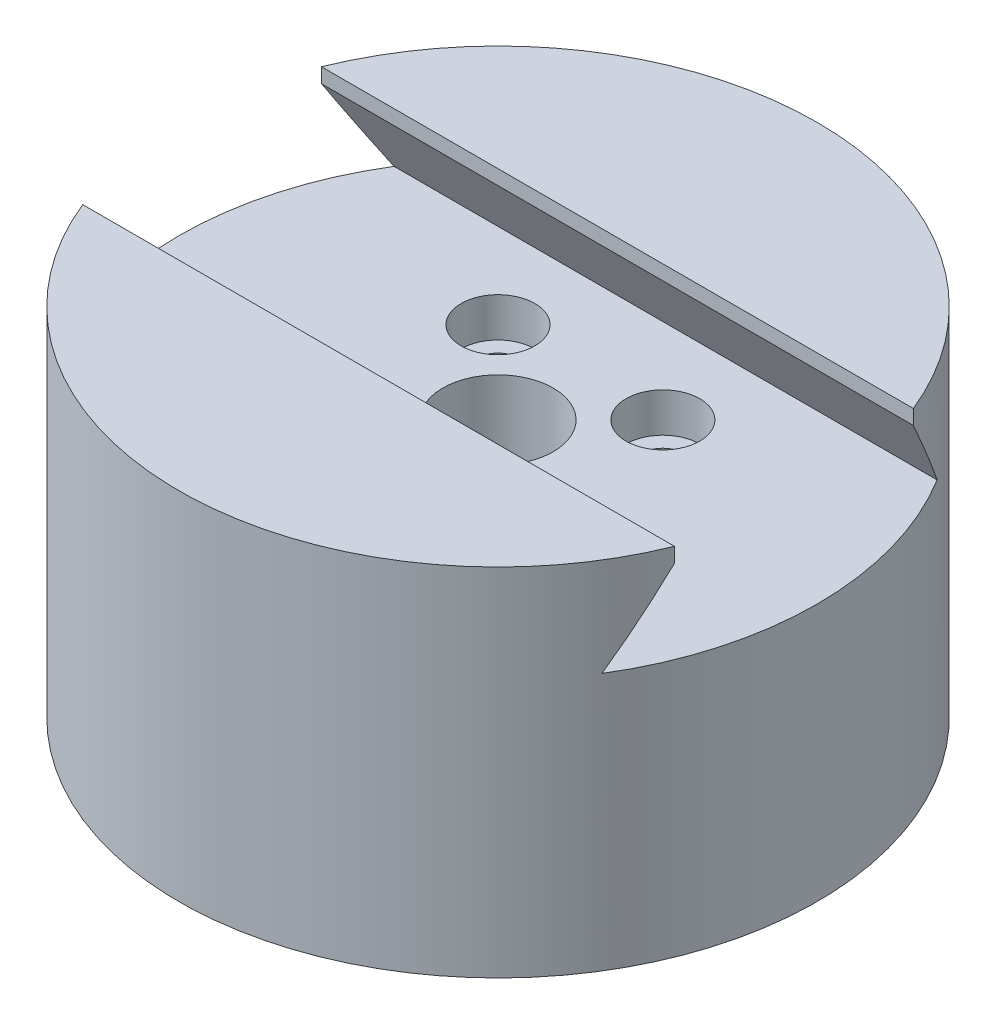
ISO-10303-21;
HEADER;
FILE_DESCRIPTION(('STEP AP214'),'2;1');
FILE_NAME('part.step','',(''),(''),'','','');
FILE_SCHEMA(('AUTOMOTIVE_DESIGN { 1 0 10303 214 1 1 1 1 }'));
ENDSEC;
DATA;
#1=APPLICATION_CONTEXT('core data for automotive mechanical design processes');
#2=APPLICATION_PROTOCOL_DEFINITION('international standard','automotive_design',2000,#1);
#3=PRODUCT_CONTEXT('',#1,'mechanical');
#4=PRODUCT('Part','Part','',(#3));
#5=PRODUCT_RELATED_PRODUCT_CATEGORY('part','',(#4));
#6=PRODUCT_DEFINITION_FORMATION('','',#4);
#7=PRODUCT_DEFINITION_CONTEXT('part definition',#1,'design');
#8=PRODUCT_DEFINITION('design','',#6,#7);
#9=PRODUCT_DEFINITION_SHAPE('','',#8);
#10=(LENGTH_UNIT() NAMED_UNIT(*) SI_UNIT(.MILLI.,.METRE.));
#11=(NAMED_UNIT(*) PLANE_ANGLE_UNIT() SI_UNIT($,.RADIAN.));
#12=(NAMED_UNIT(*) SI_UNIT($,.STERADIAN.) SOLID_ANGLE_UNIT());
#13=UNCERTAINTY_MEASURE_WITH_UNIT(LENGTH_MEASURE(1.E-05),#10,'distance_accuracy_value','');
#14=(GEOMETRIC_REPRESENTATION_CONTEXT(3) GLOBAL_UNCERTAINTY_ASSIGNED_CONTEXT((#13)) GLOBAL_UNIT_ASSIGNED_CONTEXT((#10,
#11,#12)) REPRESENTATION_CONTEXT('',''));
#15=CARTESIAN_POINT('',(0.,0.,0.));
#16=DIRECTION('',(0.,0.,1.));
#17=DIRECTION('',(1.,0.,0.));
#18=AXIS2_PLACEMENT_3D('',#15,#16,#17);
#19=CARTESIAN_POINT('',(0.,14.,0.));
#20=DIRECTION('',(0.,1.,0.));
#21=DIRECTION('',(0.,0.,1.));
#22=AXIS2_PLACEMENT_3D('',#19,#20,#21);
#23=PLANE('',#22);
#24=DIRECTION('',(1.,0.,0.));
#25=VECTOR('',#24,1.);
#26=CARTESIAN_POINT('',(0.,14.,9.72871870788977));
#27=LINE('',#26,#25);
#28=CARTESIAN_POINT('',(-24.1112428610131,14.,9.72871870788977));
#29=VERTEX_POINT('',#28);
#30=CARTESIAN_POINT('',(24.1112428610131,14.,9.72871870788977));
#31=VERTEX_POINT('',#30);
#32=EDGE_CURVE('E155',#29,#31,#27,.T.);
#33=ORIENTED_EDGE('',*,*,#32,.F.);
#34=CARTESIAN_POINT('',(0.,14.,0.));
#35=DIRECTION('',(0.,1.,0.));
#36=DIRECTION('',(0.,0.,1.));
#37=AXIS2_PLACEMENT_3D('',#34,#35,#36);
#38=CIRCLE('',#37,26.);
#39=EDGE_CURVE('E149',#29,#31,#38,.T.);
#40=ORIENTED_EDGE('',*,*,#39,.T.);
#41=EDGE_LOOP('',(#33,#40));
#42=FACE_BOUND('',#41,.T.);
#43=ADVANCED_FACE('F37',(#42),#23,.T.);
#44=CARTESIAN_POINT('',(0.,14.,0.));
#45=DIRECTION('',(0.,-1.,0.));
#46=DIRECTION('',(0.,0.,-1.));
#47=AXIS2_PLACEMENT_3D('',#44,#45,#46);
#48=CYLINDRICAL_SURFACE('',#47,26.);
#49=CARTESIAN_POINT('',(0.,29.6506350946107,0.));
#50=DIRECTION('',(0.,0.500000000000004,0.866025403784436));
#51=DIRECTION('',(0.,-0.866025403784436,0.500000000000004));
#52=AXIS2_PLACEMENT_3D('',#49,#50,#51);
#53=ELLIPSE('',#52,51.9999999999996,26.);
#54=CARTESIAN_POINT('',(22.1257576866236,6.,13.6547005383793));
#55=VERTEX_POINT('',#54);
#56=CARTESIAN_POINT('',(24.1112428610131,12.8,9.72871870788977));
#57=VERTEX_POINT('',#56);
#58=EDGE_CURVE('E12',#55,#57,#53,.T.);
#59=ORIENTED_EDGE('',*,*,#58,.T.);
#60=DIRECTION('',(0.,-1.,0.));
#61=VECTOR('',#60,1.);
#62=CARTESIAN_POINT('',(24.1112428610131,14.,9.72871870788977));
#63=LINE('',#62,#61);
#64=EDGE_CURVE('E143',#57,#31,#63,.F.);
#65=ORIENTED_EDGE('',*,*,#64,.T.);
#66=ORIENTED_EDGE('',*,*,#39,.F.);
#67=DIRECTION('',(0.,-1.,0.));
#68=VECTOR('',#67,1.);
#69=CARTESIAN_POINT('',(-24.1112428610131,14.,9.72871870788977));
#70=LINE('',#69,#68);
#71=CARTESIAN_POINT('',(-24.1112428610131,12.8,9.72871870788977));
#72=VERTEX_POINT('',#71);
#73=EDGE_CURVE('E146',#29,#72,#70,.T.);
#74=ORIENTED_EDGE('',*,*,#73,.T.);
#75=CARTESIAN_POINT('',(-22.1257576866236,6.,13.6547005383793));
#76=VERTEX_POINT('',#75);
#77=EDGE_CURVE('E47',#72,#76,#53,.T.);
#78=ORIENTED_EDGE('',*,*,#77,.T.);
#79=CARTESIAN_POINT('',(0.,6.,0.));
#80=DIRECTION('',(0.,-1.,0.));
#81=DIRECTION('',(0.,0.,-1.));
#82=AXIS2_PLACEMENT_3D('',#79,#80,#81);
#83=CIRCLE('',#82,26.);
#84=CARTESIAN_POINT('',(-22.1257576866236,6.00000000000001,-13.6547005383793));
#85=VERTEX_POINT('',#84);
#86=EDGE_CURVE('E157',#76,#85,#83,.T.);
#87=ORIENTED_EDGE('',*,*,#86,.T.);
#88=CARTESIAN_POINT('',(0.,29.6506350946107,0.));
#89=DIRECTION('',(0.,0.500000000000004,-0.866025403784436));
#90=DIRECTION('',(0.,-0.866025403784436,-0.500000000000004));
#91=AXIS2_PLACEMENT_3D('',#88,#89,#90);
#92=ELLIPSE('',#91,51.9999999999995,26.);
#93=CARTESIAN_POINT('',(-24.1112428610131,12.8,-9.72871870788977));
#94=VERTEX_POINT('',#93);
#95=EDGE_CURVE('E160',#85,#94,#92,.T.);
#96=ORIENTED_EDGE('',*,*,#95,.T.);
#97=DIRECTION('',(0.,-1.,0.));
#98=VECTOR('',#97,1.);
#99=CARTESIAN_POINT('',(-24.1112428610131,14.,-9.72871870788977));
#100=LINE('',#99,#98);
#101=CARTESIAN_POINT('',(-24.1112428610131,14.,-9.72871870788977));
#102=VERTEX_POINT('',#101);
#103=EDGE_CURVE('E131',#94,#102,#100,.F.);
#104=ORIENTED_EDGE('',*,*,#103,.T.);
#105=CARTESIAN_POINT('',(24.1112428610131,14.,-9.72871870788977));
#106=VERTEX_POINT('',#105);
#107=EDGE_CURVE('E152',#106,#102,#38,.T.);
#108=ORIENTED_EDGE('',*,*,#107,.F.);
#109=DIRECTION('',(0.,-1.,0.));
#110=VECTOR('',#109,1.);
#111=CARTESIAN_POINT('',(24.1112428610131,14.,-9.72871870788977));
#112=LINE('',#111,#110);
#113=CARTESIAN_POINT('',(24.1112428610131,12.8,-9.72871870788977));
#114=VERTEX_POINT('',#113);
#115=EDGE_CURVE('E62',#106,#114,#112,.T.);
#116=ORIENTED_EDGE('',*,*,#115,.T.);
#117=CARTESIAN_POINT('',(22.1257576866236,6.00000000000001,-13.6547005383793));
#118=VERTEX_POINT('',#117);
#119=EDGE_CURVE('E46',#114,#118,#92,.T.);
#120=ORIENTED_EDGE('',*,*,#119,.T.);
#121=EDGE_CURVE('E161',#118,#55,#83,.T.);
#122=ORIENTED_EDGE('',*,*,#121,.T.);
#123=EDGE_LOOP('',(#59,#65,#66,#74,#78,#87,#96,#104,#108,#116,#120,#122));
#124=FACE_BOUND('',#123,.T.);
#125=CARTESIAN_POINT('',(0.,-15.,0.));
#126=DIRECTION('',(0.,-1.,0.));
#127=DIRECTION('',(0.,0.,-1.));
#128=AXIS2_PLACEMENT_3D('',#125,#126,#127);
#129=CIRCLE('',#128,26.);
#130=CARTESIAN_POINT('',(0.,-15.,-26.));
#131=VERTEX_POINT('',#130);
#132=EDGE_CURVE('E433',#131,#131,#129,.T.);
#133=ORIENTED_EDGE('',*,*,#132,.F.);
#134=EDGE_LOOP('',(#133));
#135=FACE_BOUND('',#134,.T.);
#136=ADVANCED_FACE('F39',(#124,#135),#48,.T.);
#137=DIRECTION('',(-1.,0.,0.));
#138=VECTOR('',#137,1.);
#139=CARTESIAN_POINT('',(0.,14.,-9.72871870788977));
#140=LINE('',#139,#138);
#141=EDGE_CURVE('E153',#106,#102,#140,.T.);
#142=ORIENTED_EDGE('',*,*,#141,.F.);
#143=ORIENTED_EDGE('',*,*,#107,.T.);
#144=EDGE_LOOP('',(#142,#143));
#145=FACE_BOUND('',#144,.T.);
#146=ADVANCED_FACE('F176',(#145),#23,.T.);
#147=CARTESIAN_POINT('',(0.,0.,0.));
#148=DIRECTION('',(0.,1.,0.));
#149=DIRECTION('',(0.,0.,1.));
#150=AXIS2_PLACEMENT_3D('',#147,#148,#149);
#151=PLANE('',#150);
#152=CARTESIAN_POINT('',(0.,0.,0.));
#153=DIRECTION('',(0.,-1.,0.));
#154=DIRECTION('',(0.,0.,-1.));
#155=AXIS2_PLACEMENT_3D('',#152,#153,#154);
#156=CIRCLE('',#155,24.);
#157=CARTESIAN_POINT('',(0.,0.,-24.));
#158=VERTEX_POINT('',#157);
#159=EDGE_CURVE('E431',#158,#158,#156,.T.);
#160=ORIENTED_EDGE('',*,*,#159,.T.);
#161=EDGE_LOOP('',(#160));
#162=FACE_BOUND('',#161,.T.);
#163=CARTESIAN_POINT('',(-6.7175144212722,0.,-6.7175144212722));
#164=DIRECTION('',(0.,1.,0.));
#165=DIRECTION('',(0.,0.,1.));
#166=AXIS2_PLACEMENT_3D('',#163,#164,#165);
#167=CIRCLE('',#166,1.7);
#168=CARTESIAN_POINT('',(-6.7175144212722,0.,-5.0175144212722));
#169=VERTEX_POINT('',#168);
#170=EDGE_CURVE('E447',#169,#169,#167,.T.);
#171=ORIENTED_EDGE('',*,*,#170,.T.);
#172=EDGE_LOOP('',(#171));
#173=FACE_BOUND('',#172,.T.);
#174=CARTESIAN_POINT('',(6.7175144212722,0.,-6.7175144212722));
#175=DIRECTION('',(0.,1.,0.));
#176=DIRECTION('',(0.,0.,1.));
#177=AXIS2_PLACEMENT_3D('',#174,#175,#176);
#178=CIRCLE('',#177,1.7);
#179=CARTESIAN_POINT('',(6.7175144212722,0.,-5.0175144212722));
#180=VERTEX_POINT('',#179);
#181=EDGE_CURVE('E459',#180,#180,#178,.T.);
#182=ORIENTED_EDGE('',*,*,#181,.T.);
#183=EDGE_LOOP('',(#182));
#184=FACE_BOUND('',#183,.T.);
#185=CARTESIAN_POINT('',(6.71751442127219,0.,6.71751442127221));
#186=DIRECTION('',(0.,1.,0.));
#187=DIRECTION('',(0.,0.,1.));
#188=AXIS2_PLACEMENT_3D('',#185,#186,#187);
#189=CIRCLE('',#188,1.7);
#190=CARTESIAN_POINT('',(6.71751442127219,0.,8.41751442127221));
#191=VERTEX_POINT('',#190);
#192=EDGE_CURVE('E471',#191,#191,#189,.T.);
#193=ORIENTED_EDGE('',*,*,#192,.T.);
#194=EDGE_LOOP('',(#193));
#195=FACE_BOUND('',#194,.T.);
#196=CARTESIAN_POINT('',(-6.7175144212722,0.,6.7175144212722));
#197=DIRECTION('',(0.,1.,0.));
#198=DIRECTION('',(0.,0.,1.));
#199=AXIS2_PLACEMENT_3D('',#196,#197,#198);
#200=CIRCLE('',#199,1.7);
#201=CARTESIAN_POINT('',(-6.7175144212722,0.,8.4175144212722));
#202=VERTEX_POINT('',#201);
#203=EDGE_CURVE('E483',#202,#202,#200,.T.);
#204=ORIENTED_EDGE('',*,*,#203,.T.);
#205=EDGE_LOOP('',(#204));
#206=FACE_BOUND('',#205,.T.);
#207=CARTESIAN_POINT('',(0.,0.,0.));
#208=DIRECTION('',(0.,-1.,0.));
#209=DIRECTION('',(0.,0.,-1.));
#210=AXIS2_PLACEMENT_3D('',#207,#208,#209);
#211=CIRCLE('',#210,23.9);
#212=CARTESIAN_POINT('',(-18.0593563299933,0.,-15.6547005383793));
#213=VERTEX_POINT('',#212);
#214=CARTESIAN_POINT('',(18.0593563299933,0.,-15.6547005383793));
#215=VERTEX_POINT('',#214);
#216=EDGE_CURVE('E120',#213,#215,#211,.T.);
#217=ORIENTED_EDGE('',*,*,#216,.F.);
#218=DIRECTION('',(-1.,0.,0.));
#219=VECTOR('',#218,1.);
#220=CARTESIAN_POINT('',(-18.0593563299933,0.,-15.6547005383793));
#221=LINE('',#220,#219);
#222=EDGE_CURVE('E54',#215,#213,#221,.T.);
#223=ORIENTED_EDGE('',*,*,#222,.F.);
#224=EDGE_LOOP('',(#217,#223));
#225=FACE_BOUND('',#224,.T.);
#226=CARTESIAN_POINT('',(0.,0.,0.));
#227=DIRECTION('',(0.,-1.,0.));
#228=DIRECTION('',(0.,0.,-1.));
#229=AXIS2_PLACEMENT_3D('',#226,#227,#228);
#230=CIRCLE('',#229,4.5);
#231=CARTESIAN_POINT('',(0.,0.,-4.5));
#232=VERTEX_POINT('',#231);
#233=EDGE_CURVE('E125',#232,#232,#230,.T.);
#234=ORIENTED_EDGE('',*,*,#233,.F.);
#235=EDGE_LOOP('',(#234));
#236=FACE_BOUND('',#235,.T.);
#237=ADVANCED_FACE('F178',(#162,#173,#184,#195,#206,#225,#236),#151,.F.);
#238=CARTESIAN_POINT('',(-30.,6.,13.6547005383793));
#239=DIRECTION('',(0.,0.500000000000004,0.866025403784436));
#240=DIRECTION('',(0.,-0.866025403784436,0.500000000000004));
#241=AXIS2_PLACEMENT_3D('',#238,#239,#240);
#242=PLANE('',#241);
#243=DIRECTION('',(1.,0.,0.));
#244=VECTOR('',#243,1.);
#245=CARTESIAN_POINT('',(-30.,6.,13.6547005383793));
#246=LINE('',#245,#244);
#247=EDGE_CURVE('E137',#76,#55,#246,.T.);
#248=ORIENTED_EDGE('',*,*,#247,.F.);
#249=ORIENTED_EDGE('',*,*,#77,.F.);
#250=DIRECTION('',(1.,0.,0.));
#251=VECTOR('',#250,1.);
#252=CARTESIAN_POINT('',(-30.,12.8,9.72871870788977));
#253=LINE('',#252,#251);
#254=EDGE_CURVE('E128',#72,#57,#253,.T.);
#255=ORIENTED_EDGE('',*,*,#254,.T.);
#256=ORIENTED_EDGE('',*,*,#58,.F.);
#257=EDGE_LOOP('',(#248,#249,#255,#256));
#258=FACE_BOUND('',#257,.T.);
#259=ADVANCED_FACE('F185',(#258),#242,.F.);
#260=CARTESIAN_POINT('',(-30.,6.00000000000001,-13.6547005383793));
#261=DIRECTION('',(0.,0.500000000000004,-0.866025403784436));
#262=DIRECTION('',(0.,0.866025403784436,0.500000000000004));
#263=AXIS2_PLACEMENT_3D('',#260,#261,#262);
#264=PLANE('',#263);
#265=DIRECTION('',(1.,0.,0.));
#266=VECTOR('',#265,1.);
#267=CARTESIAN_POINT('',(-30.,6.00000000000001,-13.6547005383793));
#268=LINE('',#267,#266);
#269=EDGE_CURVE('E134',#85,#118,#268,.T.);
#270=ORIENTED_EDGE('',*,*,#269,.T.);
#271=ORIENTED_EDGE('',*,*,#119,.F.);
#272=DIRECTION('',(1.,0.,0.));
#273=VECTOR('',#272,1.);
#274=CARTESIAN_POINT('',(-30.,12.8,-9.72871870788977));
#275=LINE('',#274,#273);
#276=EDGE_CURVE('E132',#94,#114,#275,.T.);
#277=ORIENTED_EDGE('',*,*,#276,.F.);
#278=ORIENTED_EDGE('',*,*,#95,.F.);
#279=EDGE_LOOP('',(#270,#271,#277,#278));
#280=FACE_BOUND('',#279,.T.);
#281=ADVANCED_FACE('F171',(#280),#264,.F.);
#282=CARTESIAN_POINT('',(-30.,6.00000000000001,-13.6547005383793));
#283=DIRECTION('',(0.,-1.,0.));
#284=DIRECTION('',(0.,0.,-1.));
#285=AXIS2_PLACEMENT_3D('',#282,#283,#284);
#286=PLANE('',#285);
#287=CARTESIAN_POINT('',(-6.7175144212722,6.,-6.7175144212722));
#288=DIRECTION('',(0.,1.,0.));
#289=DIRECTION('',(0.,0.,1.));
#290=AXIS2_PLACEMENT_3D('',#287,#288,#289);
#291=CIRCLE('',#290,3.);
#292=CARTESIAN_POINT('',(-6.7175144212722,6.,-3.7175144212722));
#293=VERTEX_POINT('',#292);
#294=EDGE_CURVE('E438',#293,#293,#291,.T.);
#295=ORIENTED_EDGE('',*,*,#294,.F.);
#296=EDGE_LOOP('',(#295));
#297=FACE_BOUND('',#296,.T.);
#298=CARTESIAN_POINT('',(6.7175144212722,6.,-6.7175144212722));
#299=DIRECTION('',(0.,1.,0.));
#300=DIRECTION('',(0.,0.,1.));
#301=AXIS2_PLACEMENT_3D('',#298,#299,#300);
#302=CIRCLE('',#301,3.);
#303=CARTESIAN_POINT('',(6.7175144212722,6.,-3.7175144212722));
#304=VERTEX_POINT('',#303);
#305=EDGE_CURVE('E450',#304,#304,#302,.T.);
#306=ORIENTED_EDGE('',*,*,#305,.F.);
#307=EDGE_LOOP('',(#306));
#308=FACE_BOUND('',#307,.T.);
#309=CARTESIAN_POINT('',(6.71751442127219,6.,6.71751442127221));
#310=DIRECTION('',(0.,1.,0.));
#311=DIRECTION('',(0.,0.,1.));
#312=AXIS2_PLACEMENT_3D('',#309,#310,#311);
#313=CIRCLE('',#312,3.);
#314=CARTESIAN_POINT('',(6.71751442127219,6.,9.71751442127221));
#315=VERTEX_POINT('',#314);
#316=EDGE_CURVE('E462',#315,#315,#313,.T.);
#317=ORIENTED_EDGE('',*,*,#316,.F.);
#318=EDGE_LOOP('',(#317));
#319=FACE_BOUND('',#318,.T.);
#320=CARTESIAN_POINT('',(-6.7175144212722,6.,6.7175144212722));
#321=DIRECTION('',(0.,1.,0.));
#322=DIRECTION('',(0.,0.,1.));
#323=AXIS2_PLACEMENT_3D('',#320,#321,#322);
#324=CIRCLE('',#323,3.);
#325=CARTESIAN_POINT('',(-6.7175144212722,6.,9.7175144212722));
#326=VERTEX_POINT('',#325);
#327=EDGE_CURVE('E474',#326,#326,#324,.T.);
#328=ORIENTED_EDGE('',*,*,#327,.F.);
#329=EDGE_LOOP('',(#328));
#330=FACE_BOUND('',#329,.T.);
#331=CARTESIAN_POINT('',(0.,6.,0.));
#332=DIRECTION('',(0.,-1.,0.));
#333=DIRECTION('',(0.,0.,-1.));
#334=AXIS2_PLACEMENT_3D('',#331,#332,#333);
#335=CIRCLE('',#334,4.5);
#336=CARTESIAN_POINT('',(0.,6.,-4.5));
#337=VERTEX_POINT('',#336);
#338=EDGE_CURVE('E41',#337,#337,#335,.T.);
#339=ORIENTED_EDGE('',*,*,#338,.T.);
#340=EDGE_LOOP('',(#339));
#341=FACE_BOUND('',#340,.T.);
#342=ORIENTED_EDGE('',*,*,#269,.F.);
#343=ORIENTED_EDGE('',*,*,#86,.F.);
#344=ORIENTED_EDGE('',*,*,#247,.T.);
#345=ORIENTED_EDGE('',*,*,#121,.F.);
#346=EDGE_LOOP('',(#342,#343,#344,#345));
#347=FACE_BOUND('',#346,.T.);
#348=ADVANCED_FACE('F200',(#297,#308,#319,#330,#341,#347),#286,.F.);
#349=CARTESIAN_POINT('',(-30.,12.8,9.72871870788977));
#350=DIRECTION('',(0.,0.,1.));
#351=DIRECTION('',(1.,0.,0.));
#352=AXIS2_PLACEMENT_3D('',#349,#350,#351);
#353=PLANE('',#352);
#354=ORIENTED_EDGE('',*,*,#32,.T.);
#355=ORIENTED_EDGE('',*,*,#64,.F.);
#356=ORIENTED_EDGE('',*,*,#254,.F.);
#357=ORIENTED_EDGE('',*,*,#73,.F.);
#358=EDGE_LOOP('',(#354,#355,#356,#357));
#359=FACE_BOUND('',#358,.T.);
#360=ADVANCED_FACE('F196',(#359),#353,.F.);
#361=CARTESIAN_POINT('',(-30.,12.8,-9.72871870788977));
#362=DIRECTION('',(0.,0.,-1.));
#363=DIRECTION('',(-1.,0.,0.));
#364=AXIS2_PLACEMENT_3D('',#361,#362,#363);
#365=PLANE('',#364);
#366=ORIENTED_EDGE('',*,*,#141,.T.);
#367=ORIENTED_EDGE('',*,*,#103,.F.);
#368=ORIENTED_EDGE('',*,*,#276,.T.);
#369=ORIENTED_EDGE('',*,*,#115,.F.);
#370=EDGE_LOOP('',(#366,#367,#368,#369));
#371=FACE_BOUND('',#370,.T.);
#372=ADVANCED_FACE('F173',(#371),#365,.F.);
#373=CARTESIAN_POINT('',(0.,14.,0.));
#374=DIRECTION('',(0.,-1.,0.));
#375=DIRECTION('',(0.,0.,-1.));
#376=AXIS2_PLACEMENT_3D('',#373,#374,#375);
#377=CYLINDRICAL_SURFACE('',#376,4.5);
#378=ORIENTED_EDGE('',*,*,#233,.T.);
#379=EDGE_LOOP('',(#378));
#380=FACE_BOUND('',#379,.T.);
#381=ORIENTED_EDGE('',*,*,#338,.F.);
#382=EDGE_LOOP('',(#381));
#383=FACE_BOUND('',#382,.T.);
#384=ADVANCED_FACE('F238',(#380,#383),#377,.F.);
#385=CARTESIAN_POINT('',(0.,12.,0.));
#386=DIRECTION('',(0.,1.,0.));
#387=DIRECTION('',(0.,0.,1.));
#388=AXIS2_PLACEMENT_3D('',#385,#386,#387);
#389=PLANE('',#388);
#390=CARTESIAN_POINT('',(0.,12.,0.));
#391=DIRECTION('',(0.,1.,0.));
#392=DIRECTION('',(0.,0.,1.));
#393=AXIS2_PLACEMENT_3D('',#390,#391,#392);
#394=CIRCLE('',#393,23.9);
#395=CARTESIAN_POINT('',(-18.0593563299933,12.,-15.6547005383793));
#396=VERTEX_POINT('',#395);
#397=CARTESIAN_POINT('',(18.0593563299933,12.,-15.6547005383793));
#398=VERTEX_POINT('',#397);
#399=EDGE_CURVE('E106',#396,#398,#394,.F.);
#400=ORIENTED_EDGE('',*,*,#399,.T.);
#401=DIRECTION('',(-1.,0.,0.));
#402=VECTOR('',#401,1.);
#403=CARTESIAN_POINT('',(-18.0593563299933,12.,-15.6547005383793));
#404=LINE('',#403,#402);
#405=EDGE_CURVE('E116',#398,#396,#404,.T.);
#406=ORIENTED_EDGE('',*,*,#405,.T.);
#407=EDGE_LOOP('',(#400,#406));
#408=FACE_BOUND('',#407,.T.);
#409=ADVANCED_FACE('F118',(#408),#389,.F.);
#410=CARTESIAN_POINT('',(-18.0593563299933,51.0478928878077,-15.6547005383793));
#411=DIRECTION('',(0.,0.,1.));
#412=DIRECTION('',(1.,0.,0.));
#413=AXIS2_PLACEMENT_3D('',#410,#411,#412);
#414=PLANE('',#413);
#415=DIRECTION('',(0.,-1.,0.));
#416=VECTOR('',#415,1.);
#417=CARTESIAN_POINT('',(18.0593563299933,51.0478928878077,-15.6547005383793));
#418=LINE('',#417,#416);
#419=EDGE_CURVE('E111',#398,#215,#418,.T.);
#420=ORIENTED_EDGE('',*,*,#419,.T.);
#421=ORIENTED_EDGE('',*,*,#222,.T.);
#422=DIRECTION('',(0.,-1.,0.));
#423=VECTOR('',#422,1.);
#424=CARTESIAN_POINT('',(-18.0593563299933,51.0478928878077,-15.6547005383793));
#425=LINE('',#424,#423);
#426=EDGE_CURVE('E109',#396,#213,#425,.T.);
#427=ORIENTED_EDGE('',*,*,#426,.F.);
#428=ORIENTED_EDGE('',*,*,#405,.F.);
#429=EDGE_LOOP('',(#420,#421,#427,#428));
#430=FACE_BOUND('',#429,.T.);
#431=ADVANCED_FACE('F115',(#430),#414,.F.);
#432=CARTESIAN_POINT('',(0.,51.0478928878077,0.));
#433=DIRECTION('',(0.,-1.,0.));
#434=DIRECTION('',(0.,0.,-1.));
#435=AXIS2_PLACEMENT_3D('',#432,#433,#434);
#436=CYLINDRICAL_SURFACE('',#435,23.9);
#437=ORIENTED_EDGE('',*,*,#426,.T.);
#438=ORIENTED_EDGE('',*,*,#216,.T.);
#439=ORIENTED_EDGE('',*,*,#419,.F.);
#440=ORIENTED_EDGE('',*,*,#399,.F.);
#441=EDGE_LOOP('',(#437,#438,#439,#440));
#442=FACE_BOUND('',#441,.T.);
#443=ADVANCED_FACE('F107',(#442),#436,.F.);
#444=CARTESIAN_POINT('',(-6.7175144212722,6.,6.7175144212722));
#445=DIRECTION('',(0.,1.,0.));
#446=DIRECTION('',(0.,0.,1.));
#447=AXIS2_PLACEMENT_3D('',#444,#445,#446);
#448=CYLINDRICAL_SURFACE('',#447,1.7);
#449=ORIENTED_EDGE('',*,*,#203,.F.);
#450=EDGE_LOOP('',(#449));
#451=FACE_BOUND('',#450,.T.);
#452=CARTESIAN_POINT('',(-6.7175144212722,2.8,6.7175144212722));
#453=DIRECTION('',(0.,1.,0.));
#454=DIRECTION('',(0.,0.,1.));
#455=AXIS2_PLACEMENT_3D('',#452,#453,#454);
#456=CIRCLE('',#455,1.7);
#457=CARTESIAN_POINT('',(-6.7175144212722,2.8,8.4175144212722));
#458=VERTEX_POINT('',#457);
#459=EDGE_CURVE('E480',#458,#458,#456,.T.);
#460=ORIENTED_EDGE('',*,*,#459,.T.);
#461=EDGE_LOOP('',(#460));
#462=FACE_BOUND('',#461,.T.);
#463=ADVANCED_FACE('F270',(#451,#462),#448,.F.);
#464=CARTESIAN_POINT('',(-5.0175144212722,2.8,6.7175144212722));
#465=DIRECTION('',(0.,-1.,0.));
#466=DIRECTION('',(0.,0.,-1.));
#467=AXIS2_PLACEMENT_3D('',#464,#465,#466);
#468=PLANE('',#467);
#469=ORIENTED_EDGE('',*,*,#459,.F.);
#470=EDGE_LOOP('',(#469));
#471=FACE_BOUND('',#470,.T.);
#472=CARTESIAN_POINT('',(-6.7175144212722,2.8,6.7175144212722));
#473=DIRECTION('',(0.,1.,0.));
#474=DIRECTION('',(0.,0.,1.));
#475=AXIS2_PLACEMENT_3D('',#472,#473,#474);
#476=CIRCLE('',#475,3.);
#477=CARTESIAN_POINT('',(-6.7175144212722,2.8,9.7175144212722));
#478=VERTEX_POINT('',#477);
#479=EDGE_CURVE('E477',#478,#478,#476,.T.);
#480=ORIENTED_EDGE('',*,*,#479,.T.);
#481=EDGE_LOOP('',(#480));
#482=FACE_BOUND('',#481,.T.);
#483=ADVANCED_FACE('F283',(#471,#482),#468,.F.);
#484=CARTESIAN_POINT('',(-6.7175144212722,6.,6.7175144212722));
#485=DIRECTION('',(0.,1.,0.));
#486=DIRECTION('',(0.,0.,1.));
#487=AXIS2_PLACEMENT_3D('',#484,#485,#486);
#488=CYLINDRICAL_SURFACE('',#487,3.);
#489=ORIENTED_EDGE('',*,*,#479,.F.);
#490=EDGE_LOOP('',(#489));
#491=FACE_BOUND('',#490,.T.);
#492=ORIENTED_EDGE('',*,*,#327,.T.);
#493=EDGE_LOOP('',(#492));
#494=FACE_BOUND('',#493,.T.);
#495=ADVANCED_FACE('F293',(#491,#494),#488,.F.);
#496=CARTESIAN_POINT('',(6.71751442127219,6.,6.71751442127221));
#497=DIRECTION('',(0.,1.,0.));
#498=DIRECTION('',(0.,0.,1.));
#499=AXIS2_PLACEMENT_3D('',#496,#497,#498);
#500=CYLINDRICAL_SURFACE('',#499,1.7);
#501=ORIENTED_EDGE('',*,*,#192,.F.);
#502=EDGE_LOOP('',(#501));
#503=FACE_BOUND('',#502,.T.);
#504=CARTESIAN_POINT('',(6.71751442127219,2.8,6.71751442127221));
#505=DIRECTION('',(0.,1.,0.));
#506=DIRECTION('',(0.,0.,1.));
#507=AXIS2_PLACEMENT_3D('',#504,#505,#506);
#508=CIRCLE('',#507,1.7);
#509=CARTESIAN_POINT('',(6.71751442127219,2.8,8.41751442127221));
#510=VERTEX_POINT('',#509);
#511=EDGE_CURVE('E468',#510,#510,#508,.T.);
#512=ORIENTED_EDGE('',*,*,#511,.T.);
#513=EDGE_LOOP('',(#512));
#514=FACE_BOUND('',#513,.T.);
#515=ADVANCED_FACE('F303',(#503,#514),#500,.F.);
#516=CARTESIAN_POINT('',(8.41751442127219,2.8,6.71751442127221));
#517=DIRECTION('',(0.,-1.,0.));
#518=DIRECTION('',(0.,0.,-1.));
#519=AXIS2_PLACEMENT_3D('',#516,#517,#518);
#520=PLANE('',#519);
#521=ORIENTED_EDGE('',*,*,#511,.F.);
#522=EDGE_LOOP('',(#521));
#523=FACE_BOUND('',#522,.T.);
#524=CARTESIAN_POINT('',(6.71751442127219,2.8,6.71751442127221));
#525=DIRECTION('',(0.,1.,0.));
#526=DIRECTION('',(0.,0.,1.));
#527=AXIS2_PLACEMENT_3D('',#524,#525,#526);
#528=CIRCLE('',#527,3.);
#529=CARTESIAN_POINT('',(6.71751442127219,2.8,9.71751442127221));
#530=VERTEX_POINT('',#529);
#531=EDGE_CURVE('E465',#530,#530,#528,.T.);
#532=ORIENTED_EDGE('',*,*,#531,.T.);
#533=EDGE_LOOP('',(#532));
#534=FACE_BOUND('',#533,.T.);
#535=ADVANCED_FACE('F313',(#523,#534),#520,.F.);
#536=CARTESIAN_POINT('',(6.71751442127219,6.,6.71751442127221));
#537=DIRECTION('',(0.,1.,0.));
#538=DIRECTION('',(0.,0.,1.));
#539=AXIS2_PLACEMENT_3D('',#536,#537,#538);
#540=CYLINDRICAL_SURFACE('',#539,3.);
#541=ORIENTED_EDGE('',*,*,#531,.F.);
#542=EDGE_LOOP('',(#541));
#543=FACE_BOUND('',#542,.T.);
#544=ORIENTED_EDGE('',*,*,#316,.T.);
#545=EDGE_LOOP('',(#544));
#546=FACE_BOUND('',#545,.T.);
#547=ADVANCED_FACE('F323',(#543,#546),#540,.F.);
#548=CARTESIAN_POINT('',(6.7175144212722,6.,-6.7175144212722));
#549=DIRECTION('',(0.,1.,0.));
#550=DIRECTION('',(0.,0.,1.));
#551=AXIS2_PLACEMENT_3D('',#548,#549,#550);
#552=CYLINDRICAL_SURFACE('',#551,1.7);
#553=ORIENTED_EDGE('',*,*,#181,.F.);
#554=EDGE_LOOP('',(#553));
#555=FACE_BOUND('',#554,.T.);
#556=CARTESIAN_POINT('',(6.7175144212722,2.8,-6.7175144212722));
#557=DIRECTION('',(0.,1.,0.));
#558=DIRECTION('',(0.,0.,1.));
#559=AXIS2_PLACEMENT_3D('',#556,#557,#558);
#560=CIRCLE('',#559,1.7);
#561=CARTESIAN_POINT('',(6.7175144212722,2.8,-5.0175144212722));
#562=VERTEX_POINT('',#561);
#563=EDGE_CURVE('E456',#562,#562,#560,.T.);
#564=ORIENTED_EDGE('',*,*,#563,.T.);
#565=EDGE_LOOP('',(#564));
#566=FACE_BOUND('',#565,.T.);
#567=ADVANCED_FACE('F333',(#555,#566),#552,.F.);
#568=CARTESIAN_POINT('',(8.4175144212722,2.8,-6.7175144212722));
#569=DIRECTION('',(0.,-1.,0.));
#570=DIRECTION('',(0.,0.,-1.));
#571=AXIS2_PLACEMENT_3D('',#568,#569,#570);
#572=PLANE('',#571);
#573=ORIENTED_EDGE('',*,*,#563,.F.);
#574=EDGE_LOOP('',(#573));
#575=FACE_BOUND('',#574,.T.);
#576=CARTESIAN_POINT('',(6.7175144212722,2.8,-6.7175144212722));
#577=DIRECTION('',(0.,1.,0.));
#578=DIRECTION('',(0.,0.,1.));
#579=AXIS2_PLACEMENT_3D('',#576,#577,#578);
#580=CIRCLE('',#579,3.);
#581=CARTESIAN_POINT('',(6.7175144212722,2.8,-3.7175144212722));
#582=VERTEX_POINT('',#581);
#583=EDGE_CURVE('E453',#582,#582,#580,.T.);
#584=ORIENTED_EDGE('',*,*,#583,.T.);
#585=EDGE_LOOP('',(#584));
#586=FACE_BOUND('',#585,.T.);
#587=ADVANCED_FACE('F343',(#575,#586),#572,.F.);
#588=CARTESIAN_POINT('',(6.7175144212722,6.,-6.7175144212722));
#589=DIRECTION('',(0.,1.,0.));
#590=DIRECTION('',(0.,0.,1.));
#591=AXIS2_PLACEMENT_3D('',#588,#589,#590);
#592=CYLINDRICAL_SURFACE('',#591,3.);
#593=ORIENTED_EDGE('',*,*,#583,.F.);
#594=EDGE_LOOP('',(#593));
#595=FACE_BOUND('',#594,.T.);
#596=ORIENTED_EDGE('',*,*,#305,.T.);
#597=EDGE_LOOP('',(#596));
#598=FACE_BOUND('',#597,.T.);
#599=ADVANCED_FACE('F353',(#595,#598),#592,.F.);
#600=CARTESIAN_POINT('',(-6.7175144212722,6.,-6.7175144212722));
#601=DIRECTION('',(0.,1.,0.));
#602=DIRECTION('',(0.,0.,1.));
#603=AXIS2_PLACEMENT_3D('',#600,#601,#602);
#604=CYLINDRICAL_SURFACE('',#603,1.7);
#605=ORIENTED_EDGE('',*,*,#170,.F.);
#606=EDGE_LOOP('',(#605));
#607=FACE_BOUND('',#606,.T.);
#608=CARTESIAN_POINT('',(-6.7175144212722,2.8,-6.7175144212722));
#609=DIRECTION('',(0.,1.,0.));
#610=DIRECTION('',(0.,0.,1.));
#611=AXIS2_PLACEMENT_3D('',#608,#609,#610);
#612=CIRCLE('',#611,1.7);
#613=CARTESIAN_POINT('',(-6.7175144212722,2.8,-5.0175144212722));
#614=VERTEX_POINT('',#613);
#615=EDGE_CURVE('E444',#614,#614,#612,.T.);
#616=ORIENTED_EDGE('',*,*,#615,.T.);
#617=EDGE_LOOP('',(#616));
#618=FACE_BOUND('',#617,.T.);
#619=ADVANCED_FACE('F363',(#607,#618),#604,.F.);
#620=CARTESIAN_POINT('',(-5.0175144212722,2.8,-6.7175144212722));
#621=DIRECTION('',(0.,-1.,0.));
#622=DIRECTION('',(0.,0.,-1.));
#623=AXIS2_PLACEMENT_3D('',#620,#621,#622);
#624=PLANE('',#623);
#625=ORIENTED_EDGE('',*,*,#615,.F.);
#626=EDGE_LOOP('',(#625));
#627=FACE_BOUND('',#626,.T.);
#628=CARTESIAN_POINT('',(-6.7175144212722,2.8,-6.7175144212722));
#629=DIRECTION('',(0.,1.,0.));
#630=DIRECTION('',(0.,0.,1.));
#631=AXIS2_PLACEMENT_3D('',#628,#629,#630);
#632=CIRCLE('',#631,3.);
#633=CARTESIAN_POINT('',(-6.7175144212722,2.8,-3.7175144212722));
#634=VERTEX_POINT('',#633);
#635=EDGE_CURVE('E441',#634,#634,#632,.T.);
#636=ORIENTED_EDGE('',*,*,#635,.T.);
#637=EDGE_LOOP('',(#636));
#638=FACE_BOUND('',#637,.T.);
#639=ADVANCED_FACE('F373',(#627,#638),#624,.F.);
#640=CARTESIAN_POINT('',(-6.7175144212722,6.,-6.7175144212722));
#641=DIRECTION('',(0.,1.,0.));
#642=DIRECTION('',(0.,0.,1.));
#643=AXIS2_PLACEMENT_3D('',#640,#641,#642);
#644=CYLINDRICAL_SURFACE('',#643,3.);
#645=ORIENTED_EDGE('',*,*,#635,.F.);
#646=EDGE_LOOP('',(#645));
#647=FACE_BOUND('',#646,.T.);
#648=ORIENTED_EDGE('',*,*,#294,.T.);
#649=EDGE_LOOP('',(#648));
#650=FACE_BOUND('',#649,.T.);
#651=ADVANCED_FACE('F383',(#647,#650),#644,.F.);
#652=CARTESIAN_POINT('',(0.,-15.,0.));
#653=DIRECTION('',(0.,-1.,0.));
#654=DIRECTION('',(0.,0.,-1.));
#655=AXIS2_PLACEMENT_3D('',#652,#653,#654);
#656=PLANE('',#655);
#657=ORIENTED_EDGE('',*,*,#132,.T.);
#658=EDGE_LOOP('',(#657));
#659=FACE_BOUND('',#658,.T.);
#660=CARTESIAN_POINT('',(0.,-15.,0.));
#661=DIRECTION('',(0.,-1.,0.));
#662=DIRECTION('',(0.,0.,-1.));
#663=AXIS2_PLACEMENT_3D('',#660,#661,#662);
#664=CIRCLE('',#663,24.);
#665=CARTESIAN_POINT('',(0.,-15.,-24.));
#666=VERTEX_POINT('',#665);
#667=EDGE_CURVE('E428',#666,#666,#664,.T.);
#668=ORIENTED_EDGE('',*,*,#667,.F.);
#669=EDGE_LOOP('',(#668));
#670=FACE_BOUND('',#669,.T.);
#671=ADVANCED_FACE('F393',(#659,#670),#656,.T.);
#672=CARTESIAN_POINT('',(0.,-15.,0.));
#673=DIRECTION('',(0.,1.,0.));
#674=DIRECTION('',(0.,0.,1.));
#675=AXIS2_PLACEMENT_3D('',#672,#673,#674);
#676=CYLINDRICAL_SURFACE('',#675,24.);
#677=ORIENTED_EDGE('',*,*,#667,.T.);
#678=EDGE_LOOP('',(#677));
#679=FACE_BOUND('',#678,.T.);
#680=ORIENTED_EDGE('',*,*,#159,.F.);
#681=EDGE_LOOP('',(#680));
#682=FACE_BOUND('',#681,.T.);
#683=ADVANCED_FACE('F411',(#679,#682),#676,.F.);
#684=CLOSED_SHELL('',(#43,#136,#146,#237,#259,#281,#348,#360,#372,#384,#409,#431,#443,#463,#483,
#495,#515,#535,#547,#567,#587,#599,#619,#639,#651,#671,#683));
#685=MANIFOLD_SOLID_BREP('B2',#684);
#686=ADVANCED_BREP_SHAPE_REPRESENTATION('',(#18,#685),#14);
#687=SHAPE_DEFINITION_REPRESENTATION(#9,#686);
ENDSEC;
END-ISO-10303-21;
